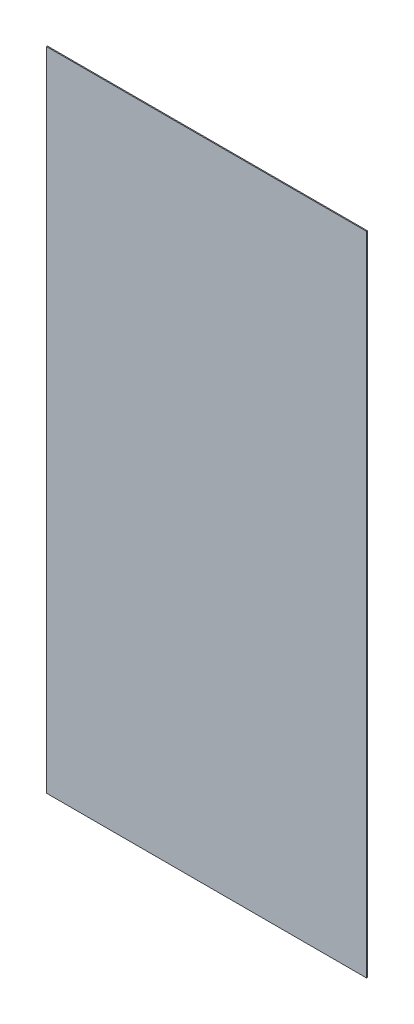
ISO-10303-21;
HEADER;
FILE_DESCRIPTION(('STEP AP214'),'2;1');
FILE_NAME('part.step','',(''),(''),'','','');
FILE_SCHEMA(('AUTOMOTIVE_DESIGN { 1 0 10303 214 1 1 1 1 }'));
ENDSEC;
DATA;
#1=APPLICATION_CONTEXT('core data for automotive mechanical design processes');
#2=APPLICATION_PROTOCOL_DEFINITION('international standard','automotive_design',2000,#1);
#3=PRODUCT_CONTEXT('',#1,'mechanical');
#4=PRODUCT('Part','Part','',(#3));
#5=PRODUCT_RELATED_PRODUCT_CATEGORY('part','',(#4));
#6=PRODUCT_DEFINITION_FORMATION('','',#4);
#7=PRODUCT_DEFINITION_CONTEXT('part definition',#1,'design');
#8=PRODUCT_DEFINITION('design','',#6,#7);
#9=PRODUCT_DEFINITION_SHAPE('','',#8);
#10=(LENGTH_UNIT() NAMED_UNIT(*) SI_UNIT(.MILLI.,.METRE.));
#11=(NAMED_UNIT(*) PLANE_ANGLE_UNIT() SI_UNIT($,.RADIAN.));
#12=(NAMED_UNIT(*) SI_UNIT($,.STERADIAN.) SOLID_ANGLE_UNIT());
#13=UNCERTAINTY_MEASURE_WITH_UNIT(LENGTH_MEASURE(1.E-05),#10,'distance_accuracy_value','');
#14=(GEOMETRIC_REPRESENTATION_CONTEXT(3) GLOBAL_UNCERTAINTY_ASSIGNED_CONTEXT((#13)) GLOBAL_UNIT_ASSIGNED_CONTEXT((#10,
#11,#12)) REPRESENTATION_CONTEXT('',''));
#15=CARTESIAN_POINT('',(0.,0.,0.));
#16=DIRECTION('',(0.,0.,1.));
#17=DIRECTION('',(1.,0.,0.));
#18=AXIS2_PLACEMENT_3D('',#15,#16,#17);
#19=CARTESIAN_POINT('',(10.,0.,3.));
#20=DIRECTION('',(-1.,0.,0.));
#21=DIRECTION('',(0.,0.,1.));
#22=AXIS2_PLACEMENT_3D('',#19,#20,#21);
#23=PLANE('',#22);
#24=DIRECTION('',(0.,1.,0.));
#25=VECTOR('',#24,1.);
#26=CARTESIAN_POINT('',(10.,0.,0.));
#27=LINE('',#26,#25);
#28=CARTESIAN_POINT('',(10.,10.,0.));
#29=VERTEX_POINT('',#28);
#30=CARTESIAN_POINT('',(10.,1990.,0.));
#31=VERTEX_POINT('',#30);
#32=EDGE_CURVE('E97',#29,#31,#27,.T.);
#33=ORIENTED_EDGE('',*,*,#32,.F.);
#34=DIRECTION('',(0.,0.,-1.));
#35=VECTOR('',#34,1.);
#36=CARTESIAN_POINT('',(10.,10.,3.));
#37=LINE('',#36,#35);
#38=CARTESIAN_POINT('',(10.,10.,3.));
#39=VERTEX_POINT('',#38);
#40=EDGE_CURVE('E11',#39,#29,#37,.T.);
#41=ORIENTED_EDGE('',*,*,#40,.F.);
#42=DIRECTION('',(0.,1.,0.));
#43=VECTOR('',#42,1.);
#44=CARTESIAN_POINT('',(10.,0.,3.));
#45=LINE('',#44,#43);
#46=CARTESIAN_POINT('',(10.,1990.,3.));
#47=VERTEX_POINT('',#46);
#48=EDGE_CURVE('E82',#39,#47,#45,.T.);
#49=ORIENTED_EDGE('',*,*,#48,.T.);
#50=DIRECTION('',(0.,0.,-1.));
#51=VECTOR('',#50,1.);
#52=CARTESIAN_POINT('',(10.,1990.,3.));
#53=LINE('',#52,#51);
#54=EDGE_CURVE('E50',#47,#31,#53,.T.);
#55=ORIENTED_EDGE('',*,*,#54,.T.);
#56=EDGE_LOOP('',(#33,#41,#49,#55));
#57=FACE_BOUND('',#56,.T.);
#58=ADVANCED_FACE('F34',(#57),#23,.T.);
#59=CARTESIAN_POINT('',(0.,10.,3.));
#60=DIRECTION('',(0.,1.,0.));
#61=DIRECTION('',(0.,0.,1.));
#62=AXIS2_PLACEMENT_3D('',#59,#60,#61);
#63=PLANE('',#62);
#64=DIRECTION('',(1.,0.,0.));
#65=VECTOR('',#64,1.);
#66=CARTESIAN_POINT('',(0.,10.,0.));
#67=LINE('',#66,#65);
#68=CARTESIAN_POINT('',(990.,10.,0.));
#69=VERTEX_POINT('',#68);
#70=EDGE_CURVE('E88',#29,#69,#67,.T.);
#71=ORIENTED_EDGE('',*,*,#70,.T.);
#72=DIRECTION('',(0.,0.,-1.));
#73=VECTOR('',#72,1.);
#74=CARTESIAN_POINT('',(990.,10.,3.));
#75=LINE('',#74,#73);
#76=CARTESIAN_POINT('',(990.,10.,3.));
#77=VERTEX_POINT('',#76);
#78=EDGE_CURVE('E42',#77,#69,#75,.T.);
#79=ORIENTED_EDGE('',*,*,#78,.F.);
#80=DIRECTION('',(1.,0.,0.));
#81=VECTOR('',#80,1.);
#82=CARTESIAN_POINT('',(0.,10.,3.));
#83=LINE('',#82,#81);
#84=EDGE_CURVE('E76',#39,#77,#83,.T.);
#85=ORIENTED_EDGE('',*,*,#84,.F.);
#86=ORIENTED_EDGE('',*,*,#40,.T.);
#87=EDGE_LOOP('',(#71,#79,#85,#86));
#88=FACE_BOUND('',#87,.T.);
#89=ADVANCED_FACE('F86',(#88),#63,.F.);
#90=CARTESIAN_POINT('',(990.,0.,3.));
#91=DIRECTION('',(-1.,0.,0.));
#92=DIRECTION('',(0.,0.,1.));
#93=AXIS2_PLACEMENT_3D('',#90,#91,#92);
#94=PLANE('',#93);
#95=DIRECTION('',(0.,1.,0.));
#96=VECTOR('',#95,1.);
#97=CARTESIAN_POINT('',(990.,0.,0.));
#98=LINE('',#97,#96);
#99=CARTESIAN_POINT('',(990.,1990.,0.));
#100=VERTEX_POINT('',#99);
#101=EDGE_CURVE('E100',#69,#100,#98,.T.);
#102=ORIENTED_EDGE('',*,*,#101,.T.);
#103=DIRECTION('',(0.,0.,-1.));
#104=VECTOR('',#103,1.);
#105=CARTESIAN_POINT('',(990.,1990.,3.));
#106=LINE('',#105,#104);
#107=CARTESIAN_POINT('',(990.,1990.,3.));
#108=VERTEX_POINT('',#107);
#109=EDGE_CURVE('E64',#108,#100,#106,.T.);
#110=ORIENTED_EDGE('',*,*,#109,.F.);
#111=DIRECTION('',(0.,1.,0.));
#112=VECTOR('',#111,1.);
#113=CARTESIAN_POINT('',(990.,0.,3.));
#114=LINE('',#113,#112);
#115=EDGE_CURVE('E81',#77,#108,#114,.T.);
#116=ORIENTED_EDGE('',*,*,#115,.F.);
#117=ORIENTED_EDGE('',*,*,#78,.T.);
#118=EDGE_LOOP('',(#102,#110,#116,#117));
#119=FACE_BOUND('',#118,.T.);
#120=ADVANCED_FACE('F91',(#119),#94,.F.);
#121=CARTESIAN_POINT('',(0.,1990.,3.));
#122=DIRECTION('',(0.,1.,0.));
#123=DIRECTION('',(0.,0.,1.));
#124=AXIS2_PLACEMENT_3D('',#121,#122,#123);
#125=PLANE('',#124);
#126=DIRECTION('',(1.,0.,0.));
#127=VECTOR('',#126,1.);
#128=CARTESIAN_POINT('',(0.,1990.,0.));
#129=LINE('',#128,#127);
#130=EDGE_CURVE('E102',#31,#100,#129,.T.);
#131=ORIENTED_EDGE('',*,*,#130,.F.);
#132=ORIENTED_EDGE('',*,*,#54,.F.);
#133=DIRECTION('',(1.,0.,0.));
#134=VECTOR('',#133,1.);
#135=CARTESIAN_POINT('',(0.,1990.,3.));
#136=LINE('',#135,#134);
#137=EDGE_CURVE('E92',#47,#108,#136,.T.);
#138=ORIENTED_EDGE('',*,*,#137,.T.);
#139=ORIENTED_EDGE('',*,*,#109,.T.);
#140=EDGE_LOOP('',(#131,#132,#138,#139));
#141=FACE_BOUND('',#140,.T.);
#142=ADVANCED_FACE('F107',(#141),#125,.T.);
#143=CARTESIAN_POINT('',(0.,0.,3.));
#144=DIRECTION('',(0.,0.,1.));
#145=DIRECTION('',(1.,0.,0.));
#146=AXIS2_PLACEMENT_3D('',#143,#144,#145);
#147=PLANE('',#146);
#148=ORIENTED_EDGE('',*,*,#48,.F.);
#149=ORIENTED_EDGE('',*,*,#84,.T.);
#150=ORIENTED_EDGE('',*,*,#115,.T.);
#151=ORIENTED_EDGE('',*,*,#137,.F.);
#152=EDGE_LOOP('',(#148,#149,#150,#151));
#153=FACE_BOUND('',#152,.T.);
#154=ADVANCED_FACE('F78',(#153),#147,.T.);
#155=CARTESIAN_POINT('',(0.,0.,0.));
#156=DIRECTION('',(0.,0.,1.));
#157=DIRECTION('',(1.,0.,0.));
#158=AXIS2_PLACEMENT_3D('',#155,#156,#157);
#159=PLANE('',#158);
#160=ORIENTED_EDGE('',*,*,#32,.T.);
#161=ORIENTED_EDGE('',*,*,#130,.T.);
#162=ORIENTED_EDGE('',*,*,#101,.F.);
#163=ORIENTED_EDGE('',*,*,#70,.F.);
#164=EDGE_LOOP('',(#160,#161,#162,#163));
#165=FACE_BOUND('',#164,.T.);
#166=ADVANCED_FACE('F114',(#165),#159,.F.);
#167=CLOSED_SHELL('',(#58,#89,#120,#142,#154,#166));
#168=MANIFOLD_SOLID_BREP('B2',#167);
#169=ADVANCED_BREP_SHAPE_REPRESENTATION('',(#18,#168),#14);
#170=SHAPE_DEFINITION_REPRESENTATION(#9,#169);
ENDSEC;
END-ISO-10303-21;
